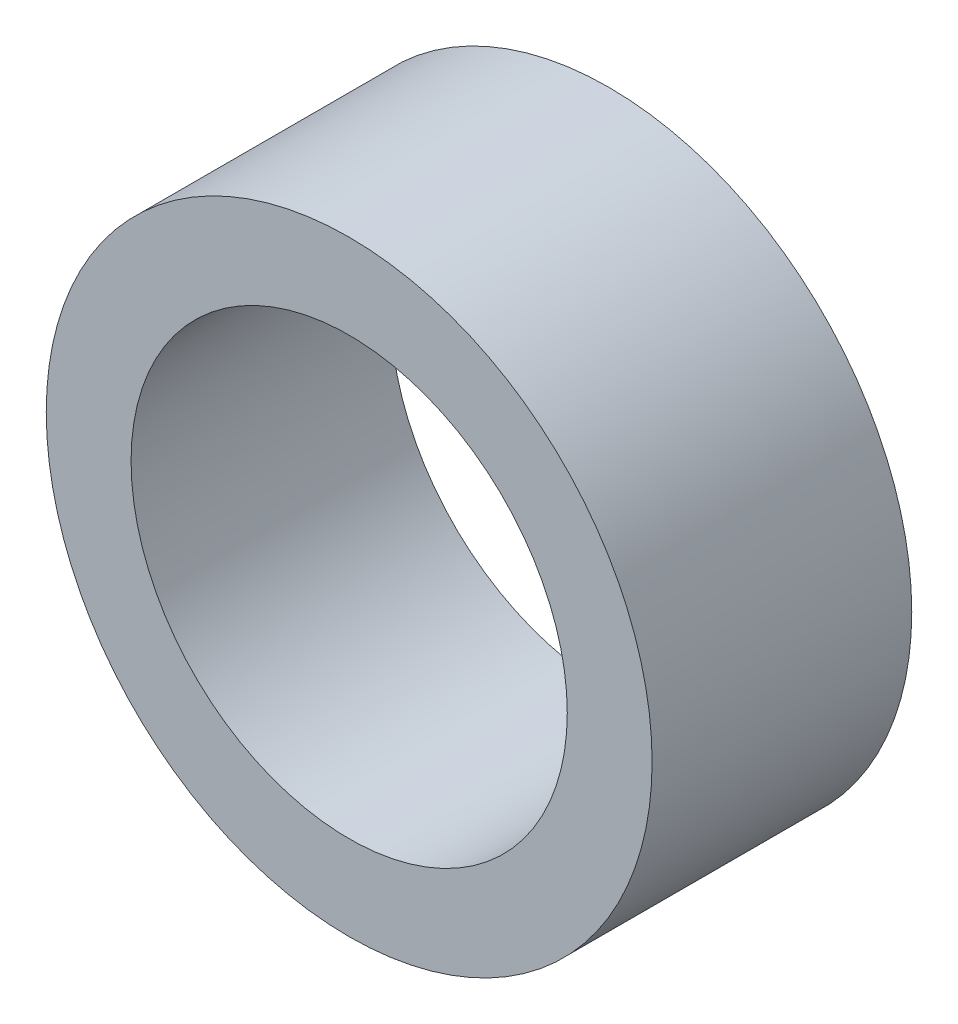
ISO-10303-21;
HEADER;
FILE_DESCRIPTION(('STEP AP214'),'2;1');
FILE_NAME('part.step','',(''),(''),'','','');
FILE_SCHEMA(('AUTOMOTIVE_DESIGN { 1 0 10303 214 1 1 1 1 }'));
ENDSEC;
DATA;
#1=APPLICATION_CONTEXT('core data for automotive mechanical design processes');
#2=APPLICATION_PROTOCOL_DEFINITION('international standard','automotive_design',2000,#1);
#3=PRODUCT_CONTEXT('',#1,'mechanical');
#4=PRODUCT('Part','Part','',(#3));
#5=PRODUCT_RELATED_PRODUCT_CATEGORY('part','',(#4));
#6=PRODUCT_DEFINITION_FORMATION('','',#4);
#7=PRODUCT_DEFINITION_CONTEXT('part definition',#1,'design');
#8=PRODUCT_DEFINITION('design','',#6,#7);
#9=PRODUCT_DEFINITION_SHAPE('','',#8);
#10=(LENGTH_UNIT() NAMED_UNIT(*) SI_UNIT(.MILLI.,.METRE.));
#11=(NAMED_UNIT(*) PLANE_ANGLE_UNIT() SI_UNIT($,.RADIAN.));
#12=(NAMED_UNIT(*) SI_UNIT($,.STERADIAN.) SOLID_ANGLE_UNIT());
#13=UNCERTAINTY_MEASURE_WITH_UNIT(LENGTH_MEASURE(1.E-05),#10,'distance_accuracy_value','');
#14=(GEOMETRIC_REPRESENTATION_CONTEXT(3) GLOBAL_UNCERTAINTY_ASSIGNED_CONTEXT((#13)) GLOBAL_UNIT_ASSIGNED_CONTEXT((#10,
#11,#12)) REPRESENTATION_CONTEXT('',''));
#15=CARTESIAN_POINT('',(0.,0.,0.));
#16=DIRECTION('',(0.,0.,1.));
#17=DIRECTION('',(1.,0.,0.));
#18=AXIS2_PLACEMENT_3D('',#15,#16,#17);
#19=CARTESIAN_POINT('',(0.,0.,15.));
#20=DIRECTION('',(0.,0.,1.));
#21=DIRECTION('',(1.,0.,0.));
#22=AXIS2_PLACEMENT_3D('',#19,#20,#21);
#23=PLANE('',#22);
#24=CARTESIAN_POINT('',(0.,0.,15.));
#25=DIRECTION('',(0.,0.,1.));
#26=DIRECTION('',(1.,0.,0.));
#27=AXIS2_PLACEMENT_3D('',#24,#25,#26);
#28=CIRCLE('',#27,35.);
#29=CARTESIAN_POINT('',(35.,0.,15.));
#30=VERTEX_POINT('',#29);
#31=EDGE_CURVE('E10',#30,#30,#28,.T.);
#32=ORIENTED_EDGE('',*,*,#31,.T.);
#33=EDGE_LOOP('',(#32));
#34=FACE_BOUND('',#33,.T.);
#35=CARTESIAN_POINT('',(0.,0.,15.));
#36=DIRECTION('',(0.,0.,1.));
#37=DIRECTION('',(1.,0.,0.));
#38=AXIS2_PLACEMENT_3D('',#35,#36,#37);
#39=CIRCLE('',#38,25.2);
#40=CARTESIAN_POINT('',(25.2,0.,15.));
#41=VERTEX_POINT('',#40);
#42=EDGE_CURVE('E44',#41,#41,#39,.T.);
#43=ORIENTED_EDGE('',*,*,#42,.F.);
#44=EDGE_LOOP('',(#43));
#45=FACE_BOUND('',#44,.T.);
#46=ADVANCED_FACE('F33',(#34,#45),#23,.T.);
#47=CARTESIAN_POINT('',(0.,0.,-15.));
#48=DIRECTION('',(0.,0.,1.));
#49=DIRECTION('',(1.,0.,0.));
#50=AXIS2_PLACEMENT_3D('',#47,#48,#49);
#51=PLANE('',#50);
#52=CARTESIAN_POINT('',(0.,0.,-15.));
#53=DIRECTION('',(0.,0.,1.));
#54=DIRECTION('',(1.,0.,0.));
#55=AXIS2_PLACEMENT_3D('',#52,#53,#54);
#56=CIRCLE('',#55,35.);
#57=CARTESIAN_POINT('',(35.,0.,-15.));
#58=VERTEX_POINT('',#57);
#59=EDGE_CURVE('E37',#58,#58,#56,.T.);
#60=ORIENTED_EDGE('',*,*,#59,.F.);
#61=EDGE_LOOP('',(#60));
#62=FACE_BOUND('',#61,.T.);
#63=CARTESIAN_POINT('',(0.,0.,-15.));
#64=DIRECTION('',(0.,0.,1.));
#65=DIRECTION('',(1.,0.,0.));
#66=AXIS2_PLACEMENT_3D('',#63,#64,#65);
#67=CIRCLE('',#66,25.2);
#68=CARTESIAN_POINT('',(25.2,0.,-15.));
#69=VERTEX_POINT('',#68);
#70=EDGE_CURVE('E46',#69,#69,#67,.T.);
#71=ORIENTED_EDGE('',*,*,#70,.T.);
#72=EDGE_LOOP('',(#71));
#73=FACE_BOUND('',#72,.T.);
#74=ADVANCED_FACE('F56',(#62,#73),#51,.F.);
#75=CARTESIAN_POINT('',(0.,0.,15.));
#76=DIRECTION('',(0.,0.,-1.));
#77=DIRECTION('',(-1.,0.,0.));
#78=AXIS2_PLACEMENT_3D('',#75,#76,#77);
#79=CYLINDRICAL_SURFACE('',#78,35.);
#80=ORIENTED_EDGE('',*,*,#31,.F.);
#81=EDGE_LOOP('',(#80));
#82=FACE_BOUND('',#81,.T.);
#83=ORIENTED_EDGE('',*,*,#59,.T.);
#84=EDGE_LOOP('',(#83));
#85=FACE_BOUND('',#84,.T.);
#86=ADVANCED_FACE('F35',(#82,#85),#79,.T.);
#87=CARTESIAN_POINT('',(0.,0.,15.));
#88=DIRECTION('',(0.,0.,-1.));
#89=DIRECTION('',(-1.,0.,0.));
#90=AXIS2_PLACEMENT_3D('',#87,#88,#89);
#91=CYLINDRICAL_SURFACE('',#90,25.2);
#92=ORIENTED_EDGE('',*,*,#42,.T.);
#93=EDGE_LOOP('',(#92));
#94=FACE_BOUND('',#93,.T.);
#95=ORIENTED_EDGE('',*,*,#70,.F.);
#96=EDGE_LOOP('',(#95));
#97=FACE_BOUND('',#96,.T.);
#98=ADVANCED_FACE('F52',(#94,#97),#91,.F.);
#99=CLOSED_SHELL('',(#46,#74,#86,#98));
#100=MANIFOLD_SOLID_BREP('B2',#99);
#101=ADVANCED_BREP_SHAPE_REPRESENTATION('',(#18,#100),#14);
#102=SHAPE_DEFINITION_REPRESENTATION(#9,#101);
ENDSEC;
END-ISO-10303-21;
